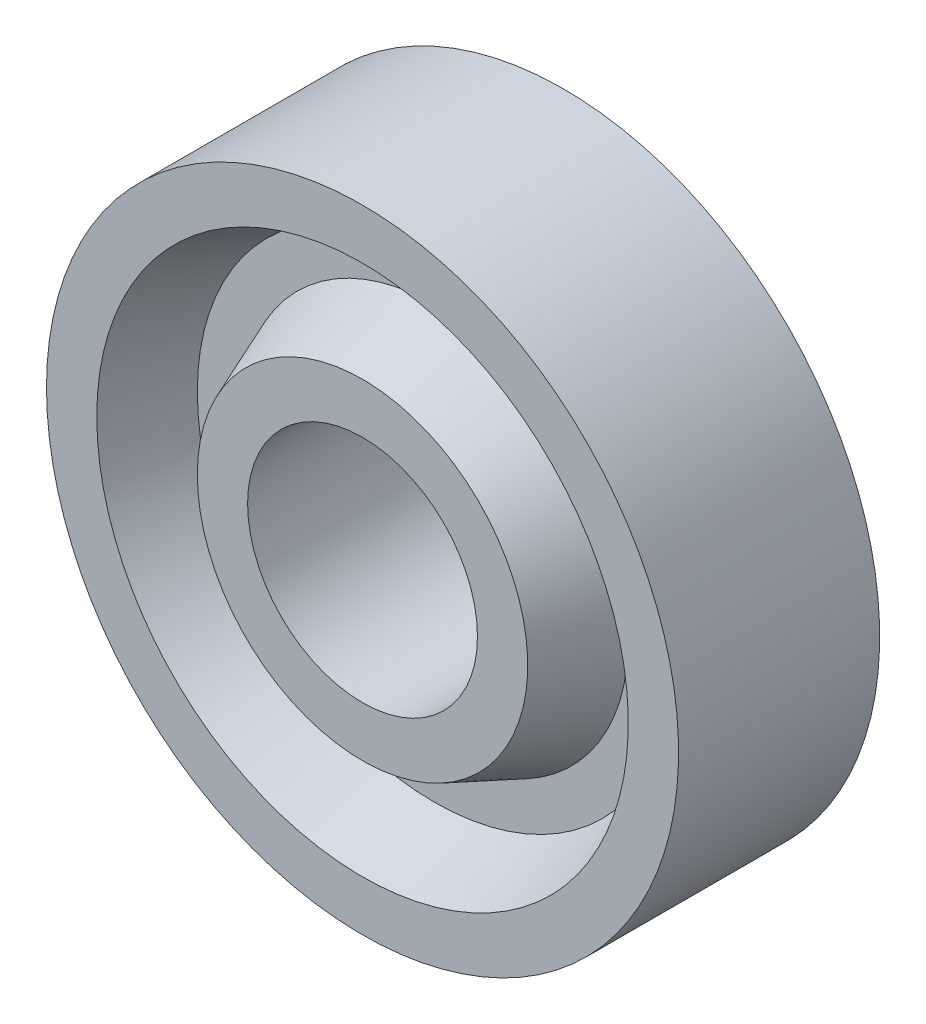
ISO-10303-21;
HEADER;
FILE_DESCRIPTION(('STEP AP214'),'2;1');
FILE_NAME('part.step','',(''),(''),'','','');
FILE_SCHEMA(('AUTOMOTIVE_DESIGN { 1 0 10303 214 1 1 1 1 }'));
ENDSEC;
DATA;
#1=APPLICATION_CONTEXT('core data for automotive mechanical design processes');
#2=APPLICATION_PROTOCOL_DEFINITION('international standard','automotive_design',2000,#1);
#3=PRODUCT_CONTEXT('',#1,'mechanical');
#4=PRODUCT('Part','Part','',(#3));
#5=PRODUCT_RELATED_PRODUCT_CATEGORY('part','',(#4));
#6=PRODUCT_DEFINITION_FORMATION('','',#4);
#7=PRODUCT_DEFINITION_CONTEXT('part definition',#1,'design');
#8=PRODUCT_DEFINITION('design','',#6,#7);
#9=PRODUCT_DEFINITION_SHAPE('','',#8);
#10=(LENGTH_UNIT() NAMED_UNIT(*) SI_UNIT(.MILLI.,.METRE.));
#11=(NAMED_UNIT(*) PLANE_ANGLE_UNIT() SI_UNIT($,.RADIAN.));
#12=(NAMED_UNIT(*) SI_UNIT($,.STERADIAN.) SOLID_ANGLE_UNIT());
#13=UNCERTAINTY_MEASURE_WITH_UNIT(LENGTH_MEASURE(1.E-05),#10,'distance_accuracy_value','');
#14=(GEOMETRIC_REPRESENTATION_CONTEXT(3) GLOBAL_UNCERTAINTY_ASSIGNED_CONTEXT((#13)) GLOBAL_UNIT_ASSIGNED_CONTEXT((#10,
#11,#12)) REPRESENTATION_CONTEXT('',''));
#15=CARTESIAN_POINT('',(0.,0.,0.));
#16=DIRECTION('',(0.,0.,1.));
#17=DIRECTION('',(1.,0.,0.));
#18=AXIS2_PLACEMENT_3D('',#15,#16,#17);
#19=CARTESIAN_POINT('',(4.,0.,-3.5));
#20=DIRECTION('',(0.,0.,1.));
#21=DIRECTION('',(1.,0.,0.));
#22=AXIS2_PLACEMENT_3D('',#19,#20,#21);
#23=PLANE('',#22);
#24=CARTESIAN_POINT('',(0.,0.,-3.5));
#25=DIRECTION('',(0.,0.,-1.));
#26=DIRECTION('',(-1.,0.,0.));
#27=AXIS2_PLACEMENT_3D('',#24,#25,#26);
#28=CIRCLE('',#27,4.);
#29=CARTESIAN_POINT('',(-3.99999999999999,0.,-3.5));
#30=VERTEX_POINT('',#29);
#31=EDGE_CURVE('E71',#30,#30,#28,.T.);
#32=ORIENTED_EDGE('',*,*,#31,.F.);
#33=EDGE_LOOP('',(#32));
#34=FACE_BOUND('',#33,.T.);
#35=CARTESIAN_POINT('',(0.,0.,-3.5));
#36=DIRECTION('',(0.,0.,-1.));
#37=DIRECTION('',(-1.,0.,0.));
#38=AXIS2_PLACEMENT_3D('',#35,#36,#37);
#39=CIRCLE('',#38,5.75);
#40=CARTESIAN_POINT('',(-5.74999999999999,0.,-3.5));
#41=VERTEX_POINT('',#40);
#42=EDGE_CURVE('E10',#41,#41,#39,.T.);
#43=ORIENTED_EDGE('',*,*,#42,.T.);
#44=EDGE_LOOP('',(#43));
#45=FACE_BOUND('',#44,.T.);
#46=ADVANCED_FACE('F31',(#34,#45),#23,.F.);
#47=CARTESIAN_POINT('',(0.,0.,-1.));
#48=DIRECTION('',(0.,0.,1.));
#49=DIRECTION('',(1.,0.,0.));
#50=AXIS2_PLACEMENT_3D('',#47,#48,#49);
#51=CONICAL_SURFACE('',#50,6.75,0.380506377112365);
#52=ORIENTED_EDGE('',*,*,#42,.F.);
#53=EDGE_LOOP('',(#52));
#54=FACE_BOUND('',#53,.T.);
#55=CARTESIAN_POINT('',(0.,0.,-1.));
#56=DIRECTION('',(0.,0.,-1.));
#57=DIRECTION('',(-1.,0.,0.));
#58=AXIS2_PLACEMENT_3D('',#55,#56,#57);
#59=CIRCLE('',#58,6.75);
#60=CARTESIAN_POINT('',(-6.74999999999999,0.,-1.));
#61=VERTEX_POINT('',#60);
#62=EDGE_CURVE('E37',#61,#61,#59,.T.);
#63=ORIENTED_EDGE('',*,*,#62,.T.);
#64=EDGE_LOOP('',(#63));
#65=FACE_BOUND('',#64,.T.);
#66=ADVANCED_FACE('F78',(#54,#65),#51,.T.);
#67=CARTESIAN_POINT('',(6.75,0.,-1.));
#68=DIRECTION('',(0.,0.,1.));
#69=DIRECTION('',(1.,0.,0.));
#70=AXIS2_PLACEMENT_3D('',#67,#68,#69);
#71=PLANE('',#70);
#72=ORIENTED_EDGE('',*,*,#62,.F.);
#73=EDGE_LOOP('',(#72));
#74=FACE_BOUND('',#73,.T.);
#75=CARTESIAN_POINT('',(0.,0.,-1.));
#76=DIRECTION('',(0.,0.,-1.));
#77=DIRECTION('',(-1.,0.,0.));
#78=AXIS2_PLACEMENT_3D('',#75,#76,#77);
#79=CIRCLE('',#78,8.24999999999999);
#80=CARTESIAN_POINT('',(-8.24999999999999,0.,-1.));
#81=VERTEX_POINT('',#80);
#82=EDGE_CURVE('E41',#81,#81,#79,.T.);
#83=ORIENTED_EDGE('',*,*,#82,.T.);
#84=EDGE_LOOP('',(#83));
#85=FACE_BOUND('',#84,.T.);
#86=ADVANCED_FACE('F82',(#74,#85),#71,.F.);
#87=CARTESIAN_POINT('',(0.,0.,-3.5));
#88=DIRECTION('',(0.,0.,-1.));
#89=DIRECTION('',(-1.,0.,0.));
#90=AXIS2_PLACEMENT_3D('',#87,#88,#89);
#91=CONICAL_SURFACE('',#90,9.25,0.380506377112365);
#92=ORIENTED_EDGE('',*,*,#82,.F.);
#93=EDGE_LOOP('',(#92));
#94=FACE_BOUND('',#93,.T.);
#95=CARTESIAN_POINT('',(0.,0.,-3.5));
#96=DIRECTION('',(0.,0.,-1.));
#97=DIRECTION('',(-1.,0.,0.));
#98=AXIS2_PLACEMENT_3D('',#95,#96,#97);
#99=CIRCLE('',#98,9.25);
#100=CARTESIAN_POINT('',(-9.24999999999999,0.,-3.5));
#101=VERTEX_POINT('',#100);
#102=EDGE_CURVE('E45',#101,#101,#99,.T.);
#103=ORIENTED_EDGE('',*,*,#102,.T.);
#104=EDGE_LOOP('',(#103));
#105=FACE_BOUND('',#104,.T.);
#106=ADVANCED_FACE('F87',(#94,#105),#91,.F.);
#107=CARTESIAN_POINT('',(9.25,0.,-3.5));
#108=DIRECTION('',(0.,0.,1.));
#109=DIRECTION('',(1.,0.,0.));
#110=AXIS2_PLACEMENT_3D('',#107,#108,#109);
#111=PLANE('',#110);
#112=ORIENTED_EDGE('',*,*,#102,.F.);
#113=EDGE_LOOP('',(#112));
#114=FACE_BOUND('',#113,.T.);
#115=CARTESIAN_POINT('',(0.,0.,-3.5));
#116=DIRECTION('',(0.,0.,-1.));
#117=DIRECTION('',(-1.,0.,0.));
#118=AXIS2_PLACEMENT_3D('',#115,#116,#117);
#119=CIRCLE('',#118,11.);
#120=CARTESIAN_POINT('',(-11.,0.,-3.5));
#121=VERTEX_POINT('',#120);
#122=EDGE_CURVE('E50',#121,#121,#119,.T.);
#123=ORIENTED_EDGE('',*,*,#122,.T.);
#124=EDGE_LOOP('',(#123));
#125=FACE_BOUND('',#124,.T.);
#126=ADVANCED_FACE('F93',(#114,#125),#111,.F.);
#127=CARTESIAN_POINT('',(0.,0.,-28.9111066531376));
#128=DIRECTION('',(0.,0.,-1.));
#129=DIRECTION('',(-1.,0.,0.));
#130=AXIS2_PLACEMENT_3D('',#127,#128,#129);
#131=CYLINDRICAL_SURFACE('',#130,11.);
#132=ORIENTED_EDGE('',*,*,#122,.F.);
#133=EDGE_LOOP('',(#132));
#134=FACE_BOUND('',#133,.T.);
#135=CARTESIAN_POINT('',(0.,0.,3.5));
#136=DIRECTION('',(0.,0.,-1.));
#137=DIRECTION('',(-1.,0.,0.));
#138=AXIS2_PLACEMENT_3D('',#135,#136,#137);
#139=CIRCLE('',#138,11.);
#140=CARTESIAN_POINT('',(-11.,0.,3.5));
#141=VERTEX_POINT('',#140);
#142=EDGE_CURVE('E53',#141,#141,#139,.T.);
#143=ORIENTED_EDGE('',*,*,#142,.T.);
#144=EDGE_LOOP('',(#143));
#145=FACE_BOUND('',#144,.T.);
#146=ADVANCED_FACE('F97',(#134,#145),#131,.T.);
#147=CARTESIAN_POINT('',(9.25,0.,3.5));
#148=DIRECTION('',(0.,0.,-1.));
#149=DIRECTION('',(-1.,0.,0.));
#150=AXIS2_PLACEMENT_3D('',#147,#148,#149);
#151=PLANE('',#150);
#152=ORIENTED_EDGE('',*,*,#142,.F.);
#153=EDGE_LOOP('',(#152));
#154=FACE_BOUND('',#153,.T.);
#155=CARTESIAN_POINT('',(0.,0.,3.5));
#156=DIRECTION('',(0.,0.,-1.));
#157=DIRECTION('',(-1.,0.,0.));
#158=AXIS2_PLACEMENT_3D('',#155,#156,#157);
#159=CIRCLE('',#158,9.24999999999999);
#160=CARTESIAN_POINT('',(-9.24999999999999,0.,3.5));
#161=VERTEX_POINT('',#160);
#162=EDGE_CURVE('E56',#161,#161,#159,.T.);
#163=ORIENTED_EDGE('',*,*,#162,.T.);
#164=EDGE_LOOP('',(#163));
#165=FACE_BOUND('',#164,.T.);
#166=ADVANCED_FACE('F101',(#154,#165),#151,.F.);
#167=CARTESIAN_POINT('',(0.,0.,1.));
#168=DIRECTION('',(0.,0.,1.));
#169=DIRECTION('',(1.,0.,0.));
#170=AXIS2_PLACEMENT_3D('',#167,#168,#169);
#171=CONICAL_SURFACE('',#170,8.24999999999999,0.380506377112364);
#172=ORIENTED_EDGE('',*,*,#162,.F.);
#173=EDGE_LOOP('',(#172));
#174=FACE_BOUND('',#173,.T.);
#175=CARTESIAN_POINT('',(0.,0.,1.));
#176=DIRECTION('',(0.,0.,-1.));
#177=DIRECTION('',(-1.,0.,0.));
#178=AXIS2_PLACEMENT_3D('',#175,#176,#177);
#179=CIRCLE('',#178,8.24999999999999);
#180=CARTESIAN_POINT('',(-8.24999999999999,0.,1.));
#181=VERTEX_POINT('',#180);
#182=EDGE_CURVE('E59',#181,#181,#179,.T.);
#183=ORIENTED_EDGE('',*,*,#182,.T.);
#184=EDGE_LOOP('',(#183));
#185=FACE_BOUND('',#184,.T.);
#186=ADVANCED_FACE('F105',(#174,#185),#171,.F.);
#187=CARTESIAN_POINT('',(8.25,0.,1.));
#188=DIRECTION('',(0.,0.,-1.));
#189=DIRECTION('',(-1.,0.,0.));
#190=AXIS2_PLACEMENT_3D('',#187,#188,#189);
#191=PLANE('',#190);
#192=ORIENTED_EDGE('',*,*,#182,.F.);
#193=EDGE_LOOP('',(#192));
#194=FACE_BOUND('',#193,.T.);
#195=CARTESIAN_POINT('',(0.,0.,1.));
#196=DIRECTION('',(0.,0.,-1.));
#197=DIRECTION('',(-1.,0.,0.));
#198=AXIS2_PLACEMENT_3D('',#195,#196,#197);
#199=CIRCLE('',#198,6.74999999999999);
#200=CARTESIAN_POINT('',(-6.74999999999999,0.,1.));
#201=VERTEX_POINT('',#200);
#202=EDGE_CURVE('E62',#201,#201,#199,.T.);
#203=ORIENTED_EDGE('',*,*,#202,.T.);
#204=EDGE_LOOP('',(#203));
#205=FACE_BOUND('',#204,.T.);
#206=ADVANCED_FACE('F109',(#194,#205),#191,.F.);
#207=CARTESIAN_POINT('',(0.,0.,3.5));
#208=DIRECTION('',(0.,0.,-1.));
#209=DIRECTION('',(-1.,0.,0.));
#210=AXIS2_PLACEMENT_3D('',#207,#208,#209);
#211=CONICAL_SURFACE('',#210,5.75,0.380506377112364);
#212=ORIENTED_EDGE('',*,*,#202,.F.);
#213=EDGE_LOOP('',(#212));
#214=FACE_BOUND('',#213,.T.);
#215=CARTESIAN_POINT('',(0.,0.,3.5));
#216=DIRECTION('',(0.,0.,-1.));
#217=DIRECTION('',(-1.,0.,0.));
#218=AXIS2_PLACEMENT_3D('',#215,#216,#217);
#219=CIRCLE('',#218,5.75);
#220=CARTESIAN_POINT('',(-5.74999999999999,0.,3.5));
#221=VERTEX_POINT('',#220);
#222=EDGE_CURVE('E65',#221,#221,#219,.T.);
#223=ORIENTED_EDGE('',*,*,#222,.T.);
#224=EDGE_LOOP('',(#223));
#225=FACE_BOUND('',#224,.T.);
#226=ADVANCED_FACE('F113',(#214,#225),#211,.T.);
#227=CARTESIAN_POINT('',(4.,0.,3.5));
#228=DIRECTION('',(0.,0.,-1.));
#229=DIRECTION('',(-1.,0.,0.));
#230=AXIS2_PLACEMENT_3D('',#227,#228,#229);
#231=PLANE('',#230);
#232=ORIENTED_EDGE('',*,*,#222,.F.);
#233=EDGE_LOOP('',(#232));
#234=FACE_BOUND('',#233,.T.);
#235=CARTESIAN_POINT('',(0.,0.,3.5));
#236=DIRECTION('',(0.,0.,-1.));
#237=DIRECTION('',(-1.,0.,0.));
#238=AXIS2_PLACEMENT_3D('',#235,#236,#237);
#239=CIRCLE('',#238,4.);
#240=CARTESIAN_POINT('',(-3.99999999999999,0.,3.5));
#241=VERTEX_POINT('',#240);
#242=EDGE_CURVE('E68',#241,#241,#239,.T.);
#243=ORIENTED_EDGE('',*,*,#242,.T.);
#244=EDGE_LOOP('',(#243));
#245=FACE_BOUND('',#244,.T.);
#246=ADVANCED_FACE('F117',(#234,#245),#231,.F.);
#247=CARTESIAN_POINT('',(0.,0.,-28.9111066531376));
#248=DIRECTION('',(0.,0.,-1.));
#249=DIRECTION('',(-1.,0.,0.));
#250=AXIS2_PLACEMENT_3D('',#247,#248,#249);
#251=CYLINDRICAL_SURFACE('',#250,4.);
#252=ORIENTED_EDGE('',*,*,#242,.F.);
#253=EDGE_LOOP('',(#252));
#254=FACE_BOUND('',#253,.T.);
#255=ORIENTED_EDGE('',*,*,#31,.T.);
#256=EDGE_LOOP('',(#255));
#257=FACE_BOUND('',#256,.T.);
#258=ADVANCED_FACE('F75',(#254,#257),#251,.F.);
#259=CLOSED_SHELL('',(#46,#66,#86,#106,#126,#146,#166,#186,#206,#226,#246,#258));
#260=MANIFOLD_SOLID_BREP('B2',#259);
#261=ADVANCED_BREP_SHAPE_REPRESENTATION('',(#18,#260),#14);
#262=SHAPE_DEFINITION_REPRESENTATION(#9,#261);
ENDSEC;
END-ISO-10303-21;
